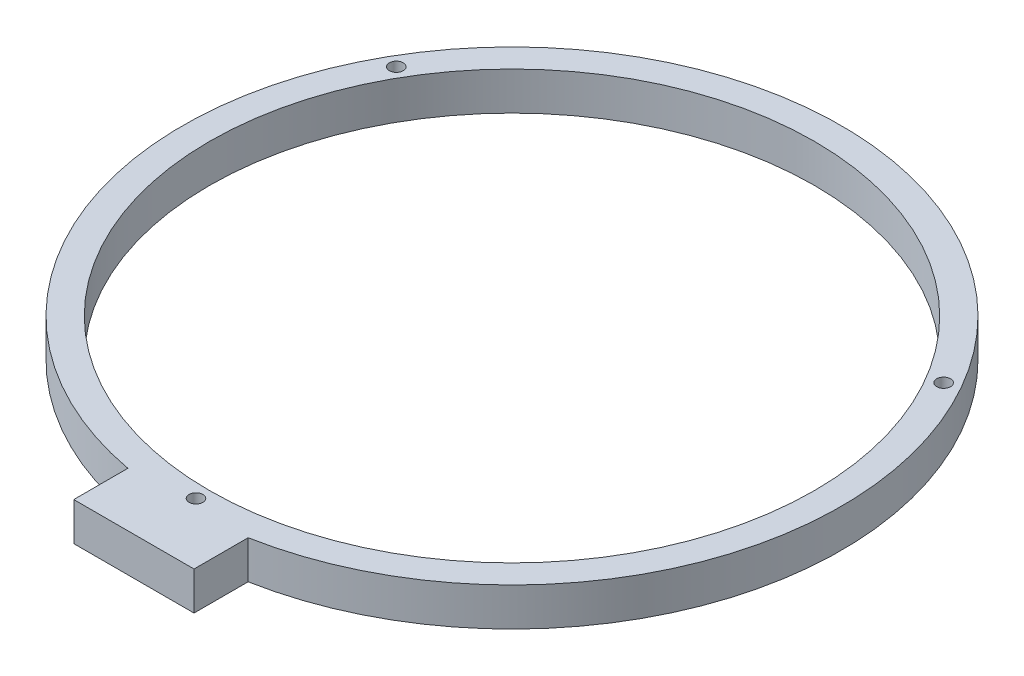
ISO-10303-21;
HEADER;
FILE_DESCRIPTION(('STEP AP214'),'2;1');
FILE_NAME('part.step','',(''),(''),'','','');
FILE_SCHEMA(('AUTOMOTIVE_DESIGN { 1 0 10303 214 1 1 1 1 }'));
ENDSEC;
DATA;
#1=APPLICATION_CONTEXT('core data for automotive mechanical design processes');
#2=APPLICATION_PROTOCOL_DEFINITION('international standard','automotive_design',2000,#1);
#3=PRODUCT_CONTEXT('',#1,'mechanical');
#4=PRODUCT('Part','Part','',(#3));
#5=PRODUCT_RELATED_PRODUCT_CATEGORY('part','',(#4));
#6=PRODUCT_DEFINITION_FORMATION('','',#4);
#7=PRODUCT_DEFINITION_CONTEXT('part definition',#1,'design');
#8=PRODUCT_DEFINITION('design','',#6,#7);
#9=PRODUCT_DEFINITION_SHAPE('','',#8);
#10=(LENGTH_UNIT() NAMED_UNIT(*) SI_UNIT(.MILLI.,.METRE.));
#11=(NAMED_UNIT(*) PLANE_ANGLE_UNIT() SI_UNIT($,.RADIAN.));
#12=(NAMED_UNIT(*) SI_UNIT($,.STERADIAN.) SOLID_ANGLE_UNIT());
#13=UNCERTAINTY_MEASURE_WITH_UNIT(LENGTH_MEASURE(1.E-05),#10,'distance_accuracy_value','');
#14=(GEOMETRIC_REPRESENTATION_CONTEXT(3) GLOBAL_UNCERTAINTY_ASSIGNED_CONTEXT((#13)) GLOBAL_UNIT_ASSIGNED_CONTEXT((#10,
#11,#12)) REPRESENTATION_CONTEXT('',''));
#15=CARTESIAN_POINT('',(0.,0.,0.));
#16=DIRECTION('',(0.,0.,1.));
#17=DIRECTION('',(1.,0.,0.));
#18=AXIS2_PLACEMENT_3D('',#15,#16,#17);
#19=CARTESIAN_POINT('',(0.,6.35,0.));
#20=DIRECTION('',(0.,1.,0.));
#21=DIRECTION('',(0.,0.,1.));
#22=AXIS2_PLACEMENT_3D('',#19,#20,#21);
#23=PLANE('',#22);
#24=CARTESIAN_POINT('',(45.5096349688721,6.35,-26.2750000000002));
#25=DIRECTION('',(0.,1.,0.));
#26=DIRECTION('',(0.866025403784436,0.,-0.500000000000004));
#27=AXIS2_PLACEMENT_3D('',#24,#25,#26);
#28=CIRCLE('',#27,1.15);
#29=CARTESIAN_POINT('',(46.5055641832242,6.35,-26.8500000000002));
#30=VERTEX_POINT('',#29);
#31=EDGE_CURVE('E130',#30,#30,#28,.T.);
#32=ORIENTED_EDGE('',*,*,#31,.F.);
#33=EDGE_LOOP('',(#32));
#34=FACE_BOUND('',#33,.T.);
#35=CARTESIAN_POINT('',(-45.5096349688725,6.35,-26.2749999999996));
#36=DIRECTION('',(0.,1.,0.));
#37=DIRECTION('',(-0.866025403784443,0.,-0.499999999999992));
#38=AXIS2_PLACEMENT_3D('',#35,#36,#37);
#39=CIRCLE('',#38,1.15);
#40=CARTESIAN_POINT('',(-46.5055641832246,6.35,-26.8499999999996));
#41=VERTEX_POINT('',#40);
#42=EDGE_CURVE('E131',#41,#41,#39,.T.);
#43=ORIENTED_EDGE('',*,*,#42,.F.);
#44=EDGE_LOOP('',(#43));
#45=FACE_BOUND('',#44,.T.);
#46=CARTESIAN_POINT('',(0.,6.35,52.55));
#47=DIRECTION('',(0.,1.,0.));
#48=DIRECTION('',(0.,0.,1.));
#49=AXIS2_PLACEMENT_3D('',#46,#47,#48);
#50=CIRCLE('',#49,1.15);
#51=CARTESIAN_POINT('',(0.,6.35,53.7));
#52=VERTEX_POINT('',#51);
#53=EDGE_CURVE('E123',#52,#52,#50,.T.);
#54=ORIENTED_EDGE('',*,*,#53,.F.);
#55=EDGE_LOOP('',(#54));
#56=FACE_BOUND('',#55,.T.);
#57=CARTESIAN_POINT('',(0.,6.35,0.));
#58=DIRECTION('',(0.,1.,0.));
#59=DIRECTION('',(0.,0.,1.));
#60=AXIS2_PLACEMENT_3D('',#57,#58,#59);
#61=CIRCLE('',#60,54.8);
#62=CARTESIAN_POINT('',(10.,6.35,53.8798663695448));
#63=VERTEX_POINT('',#62);
#64=CARTESIAN_POINT('',(-10.,6.35,53.8798663695448));
#65=VERTEX_POINT('',#64);
#66=EDGE_CURVE('E88',#63,#65,#61,.T.);
#67=ORIENTED_EDGE('',*,*,#66,.T.);
#68=DIRECTION('',(0.,0.,1.));
#69=VECTOR('',#68,1.);
#70=CARTESIAN_POINT('',(-10.,6.35,53.8798663695448));
#71=LINE('',#70,#69);
#72=CARTESIAN_POINT('',(-10.,6.35,62.8798663695448));
#73=VERTEX_POINT('',#72);
#74=EDGE_CURVE('E83',#65,#73,#71,.T.);
#75=ORIENTED_EDGE('',*,*,#74,.T.);
#76=DIRECTION('',(1.,0.,0.));
#77=VECTOR('',#76,1.);
#78=CARTESIAN_POINT('',(-10.,6.35,62.8798663695448));
#79=LINE('',#78,#77);
#80=CARTESIAN_POINT('',(10.,6.35,62.8798663695448));
#81=VERTEX_POINT('',#80);
#82=EDGE_CURVE('E86',#73,#81,#79,.T.);
#83=ORIENTED_EDGE('',*,*,#82,.T.);
#84=DIRECTION('',(0.,0.,-1.));
#85=VECTOR('',#84,1.);
#86=CARTESIAN_POINT('',(10.,6.35,62.8798663695448));
#87=LINE('',#86,#85);
#88=EDGE_CURVE('E53',#81,#63,#87,.T.);
#89=ORIENTED_EDGE('',*,*,#88,.T.);
#90=EDGE_LOOP('',(#67,#75,#83,#89));
#91=FACE_BOUND('',#90,.T.);
#92=CARTESIAN_POINT('',(0.,6.35,0.));
#93=DIRECTION('',(0.,1.,0.));
#94=DIRECTION('',(0.,0.,1.));
#95=AXIS2_PLACEMENT_3D('',#92,#93,#94);
#96=CIRCLE('',#95,50.3);
#97=CARTESIAN_POINT('',(0.,6.35,50.3));
#98=VERTEX_POINT('',#97);
#99=EDGE_CURVE('E103',#98,#98,#96,.T.);
#100=ORIENTED_EDGE('',*,*,#99,.F.);
#101=EDGE_LOOP('',(#100));
#102=FACE_BOUND('',#101,.T.);
#103=ADVANCED_FACE('F36',(#34,#45,#56,#91,#102),#23,.T.);
#104=CARTESIAN_POINT('',(0.,0.,0.));
#105=DIRECTION('',(0.,1.,0.));
#106=DIRECTION('',(0.,0.,1.));
#107=AXIS2_PLACEMENT_3D('',#104,#105,#106);
#108=PLANE('',#107);
#109=CARTESIAN_POINT('',(45.5096349688721,0.,-26.2750000000002));
#110=DIRECTION('',(0.,1.,0.));
#111=DIRECTION('',(0.,0.,1.));
#112=AXIS2_PLACEMENT_3D('',#109,#110,#111);
#113=CIRCLE('',#112,1.15);
#114=CARTESIAN_POINT('',(45.5096349688721,0.,-25.1250000000002));
#115=VERTEX_POINT('',#114);
#116=EDGE_CURVE('E126',#115,#115,#113,.F.);
#117=ORIENTED_EDGE('',*,*,#116,.F.);
#118=EDGE_LOOP('',(#117));
#119=FACE_BOUND('',#118,.T.);
#120=CARTESIAN_POINT('',(-45.5096349688725,0.,-26.2749999999996));
#121=DIRECTION('',(0.,1.,0.));
#122=DIRECTION('',(0.,0.,1.));
#123=AXIS2_PLACEMENT_3D('',#120,#121,#122);
#124=CIRCLE('',#123,1.15);
#125=CARTESIAN_POINT('',(-45.5096349688725,0.,-25.1249999999996));
#126=VERTEX_POINT('',#125);
#127=EDGE_CURVE('E127',#126,#126,#124,.F.);
#128=ORIENTED_EDGE('',*,*,#127,.F.);
#129=EDGE_LOOP('',(#128));
#130=FACE_BOUND('',#129,.T.);
#131=CARTESIAN_POINT('',(0.,0.,52.55));
#132=DIRECTION('',(0.,1.,0.));
#133=DIRECTION('',(0.,0.,1.));
#134=AXIS2_PLACEMENT_3D('',#131,#132,#133);
#135=CIRCLE('',#134,1.15);
#136=CARTESIAN_POINT('',(0.,0.,53.7));
#137=VERTEX_POINT('',#136);
#138=EDGE_CURVE('E118',#137,#137,#135,.F.);
#139=ORIENTED_EDGE('',*,*,#138,.F.);
#140=EDGE_LOOP('',(#139));
#141=FACE_BOUND('',#140,.T.);
#142=CARTESIAN_POINT('',(0.,0.,0.));
#143=DIRECTION('',(0.,1.,0.));
#144=DIRECTION('',(0.,0.,1.));
#145=AXIS2_PLACEMENT_3D('',#142,#143,#144);
#146=CIRCLE('',#145,54.8);
#147=CARTESIAN_POINT('',(10.,0.,53.8798663695448));
#148=VERTEX_POINT('',#147);
#149=CARTESIAN_POINT('',(-10.,0.,53.8798663695448));
#150=VERTEX_POINT('',#149);
#151=EDGE_CURVE('E100',#148,#150,#146,.T.);
#152=ORIENTED_EDGE('',*,*,#151,.F.);
#153=DIRECTION('',(0.,0.,-1.));
#154=VECTOR('',#153,1.);
#155=CARTESIAN_POINT('',(10.,0.,62.8798663695448));
#156=LINE('',#155,#154);
#157=CARTESIAN_POINT('',(10.,0.,62.8798663695448));
#158=VERTEX_POINT('',#157);
#159=EDGE_CURVE('E76',#158,#148,#156,.T.);
#160=ORIENTED_EDGE('',*,*,#159,.F.);
#161=DIRECTION('',(1.,0.,0.));
#162=VECTOR('',#161,1.);
#163=CARTESIAN_POINT('',(-10.,0.,62.8798663695448));
#164=LINE('',#163,#162);
#165=CARTESIAN_POINT('',(-10.,0.,62.8798663695448));
#166=VERTEX_POINT('',#165);
#167=EDGE_CURVE('E70',#166,#158,#164,.T.);
#168=ORIENTED_EDGE('',*,*,#167,.F.);
#169=DIRECTION('',(0.,0.,1.));
#170=VECTOR('',#169,1.);
#171=CARTESIAN_POINT('',(-10.,0.,53.8798663695448));
#172=LINE('',#171,#170);
#173=EDGE_CURVE('E92',#150,#166,#172,.T.);
#174=ORIENTED_EDGE('',*,*,#173,.F.);
#175=EDGE_LOOP('',(#152,#160,#168,#174));
#176=FACE_BOUND('',#175,.T.);
#177=CARTESIAN_POINT('',(0.,0.,0.));
#178=DIRECTION('',(0.,1.,0.));
#179=DIRECTION('',(0.,0.,1.));
#180=AXIS2_PLACEMENT_3D('',#177,#178,#179);
#181=CIRCLE('',#180,50.3);
#182=CARTESIAN_POINT('',(0.,0.,50.3));
#183=VERTEX_POINT('',#182);
#184=EDGE_CURVE('E115',#183,#183,#181,.T.);
#185=ORIENTED_EDGE('',*,*,#184,.T.);
#186=EDGE_LOOP('',(#185));
#187=FACE_BOUND('',#186,.T.);
#188=ADVANCED_FACE('F111',(#119,#130,#141,#176,#187),#108,.F.);
#189=CARTESIAN_POINT('',(0.,6.35,0.));
#190=DIRECTION('',(0.,-1.,0.));
#191=DIRECTION('',(0.,0.,-1.));
#192=AXIS2_PLACEMENT_3D('',#189,#190,#191);
#193=CYLINDRICAL_SURFACE('',#192,54.8);
#194=ORIENTED_EDGE('',*,*,#151,.T.);
#195=DIRECTION('',(0.,-1.,0.));
#196=VECTOR('',#195,1.);
#197=CARTESIAN_POINT('',(-10.,6.35,53.8798663695448));
#198=LINE('',#197,#196);
#199=EDGE_CURVE('E11',#65,#150,#198,.T.);
#200=ORIENTED_EDGE('',*,*,#199,.F.);
#201=ORIENTED_EDGE('',*,*,#66,.F.);
#202=DIRECTION('',(0.,-1.,0.));
#203=VECTOR('',#202,1.);
#204=CARTESIAN_POINT('',(10.,6.35,53.8798663695448));
#205=LINE('',#204,#203);
#206=EDGE_CURVE('E96',#63,#148,#205,.T.);
#207=ORIENTED_EDGE('',*,*,#206,.T.);
#208=EDGE_LOOP('',(#194,#200,#201,#207));
#209=FACE_BOUND('',#208,.T.);
#210=ADVANCED_FACE('F38',(#209),#193,.T.);
#211=CARTESIAN_POINT('',(-10.,6.35,53.8798663695448));
#212=DIRECTION('',(1.,0.,0.));
#213=DIRECTION('',(0.,0.,-1.));
#214=AXIS2_PLACEMENT_3D('',#211,#212,#213);
#215=PLANE('',#214);
#216=ORIENTED_EDGE('',*,*,#173,.T.);
#217=DIRECTION('',(0.,-1.,0.));
#218=VECTOR('',#217,1.);
#219=CARTESIAN_POINT('',(-10.,6.35,62.8798663695448));
#220=LINE('',#219,#218);
#221=EDGE_CURVE('E45',#73,#166,#220,.T.);
#222=ORIENTED_EDGE('',*,*,#221,.F.);
#223=ORIENTED_EDGE('',*,*,#74,.F.);
#224=ORIENTED_EDGE('',*,*,#199,.T.);
#225=EDGE_LOOP('',(#216,#222,#223,#224));
#226=FACE_BOUND('',#225,.T.);
#227=ADVANCED_FACE('F91',(#226),#215,.F.);
#228=CARTESIAN_POINT('',(-10.,6.35,62.8798663695448));
#229=DIRECTION('',(0.,0.,-1.));
#230=DIRECTION('',(-1.,0.,0.));
#231=AXIS2_PLACEMENT_3D('',#228,#229,#230);
#232=PLANE('',#231);
#233=ORIENTED_EDGE('',*,*,#167,.T.);
#234=DIRECTION('',(0.,-1.,0.));
#235=VECTOR('',#234,1.);
#236=CARTESIAN_POINT('',(10.,6.35,62.8798663695448));
#237=LINE('',#236,#235);
#238=EDGE_CURVE('E93',#81,#158,#237,.T.);
#239=ORIENTED_EDGE('',*,*,#238,.F.);
#240=ORIENTED_EDGE('',*,*,#82,.F.);
#241=ORIENTED_EDGE('',*,*,#221,.T.);
#242=EDGE_LOOP('',(#233,#239,#240,#241));
#243=FACE_BOUND('',#242,.T.);
#244=ADVANCED_FACE('F94',(#243),#232,.F.);
#245=CARTESIAN_POINT('',(10.,6.35,62.8798663695448));
#246=DIRECTION('',(-1.,0.,0.));
#247=DIRECTION('',(0.,0.,1.));
#248=AXIS2_PLACEMENT_3D('',#245,#246,#247);
#249=PLANE('',#248);
#250=ORIENTED_EDGE('',*,*,#159,.T.);
#251=ORIENTED_EDGE('',*,*,#206,.F.);
#252=ORIENTED_EDGE('',*,*,#88,.F.);
#253=ORIENTED_EDGE('',*,*,#238,.T.);
#254=EDGE_LOOP('',(#250,#251,#252,#253));
#255=FACE_BOUND('',#254,.T.);
#256=ADVANCED_FACE('F108',(#255),#249,.F.);
#257=CARTESIAN_POINT('',(0.,6.35,0.));
#258=DIRECTION('',(0.,-1.,0.));
#259=DIRECTION('',(0.,0.,-1.));
#260=AXIS2_PLACEMENT_3D('',#257,#258,#259);
#261=CYLINDRICAL_SURFACE('',#260,50.3);
#262=ORIENTED_EDGE('',*,*,#99,.T.);
#263=EDGE_LOOP('',(#262));
#264=FACE_BOUND('',#263,.T.);
#265=ORIENTED_EDGE('',*,*,#184,.F.);
#266=EDGE_LOOP('',(#265));
#267=FACE_BOUND('',#266,.T.);
#268=ADVANCED_FACE('F153',(#264,#267),#261,.F.);
#269=CARTESIAN_POINT('',(0.,-0.00100000000000013,52.55));
#270=DIRECTION('',(0.,1.,0.));
#271=DIRECTION('',(0.,0.,1.));
#272=AXIS2_PLACEMENT_3D('',#269,#270,#271);
#273=CYLINDRICAL_SURFACE('',#272,1.15);
#274=ORIENTED_EDGE('',*,*,#53,.T.);
#275=EDGE_LOOP('',(#274));
#276=FACE_BOUND('',#275,.T.);
#277=ORIENTED_EDGE('',*,*,#138,.T.);
#278=EDGE_LOOP('',(#277));
#279=FACE_BOUND('',#278,.T.);
#280=ADVANCED_FACE('F149',(#276,#279),#273,.F.);
#281=CARTESIAN_POINT('',(-45.5096349688725,-0.00100000000000013,-26.2749999999996));
#282=DIRECTION('',(0.,1.,0.));
#283=DIRECTION('',(0.,0.,1.));
#284=AXIS2_PLACEMENT_3D('',#281,#282,#283);
#285=CYLINDRICAL_SURFACE('',#284,1.15);
#286=ORIENTED_EDGE('',*,*,#42,.T.);
#287=EDGE_LOOP('',(#286));
#288=FACE_BOUND('',#287,.T.);
#289=ORIENTED_EDGE('',*,*,#127,.T.);
#290=EDGE_LOOP('',(#289));
#291=FACE_BOUND('',#290,.T.);
#292=ADVANCED_FACE('F152',(#288,#291),#285,.F.);
#293=CARTESIAN_POINT('',(45.5096349688721,-0.00100000000000013,-26.2750000000002));
#294=DIRECTION('',(0.,1.,0.));
#295=DIRECTION('',(0.,0.,1.));
#296=AXIS2_PLACEMENT_3D('',#293,#294,#295);
#297=CYLINDRICAL_SURFACE('',#296,1.15);
#298=ORIENTED_EDGE('',*,*,#31,.T.);
#299=EDGE_LOOP('',(#298));
#300=FACE_BOUND('',#299,.T.);
#301=ORIENTED_EDGE('',*,*,#116,.T.);
#302=EDGE_LOOP('',(#301));
#303=FACE_BOUND('',#302,.T.);
#304=ADVANCED_FACE('F139',(#300,#303),#297,.F.);
#305=CLOSED_SHELL('',(#103,#188,#210,#227,#244,#256,#268,#280,#292,#304));
#306=MANIFOLD_SOLID_BREP('B2',#305);
#307=ADVANCED_BREP_SHAPE_REPRESENTATION('',(#18,#306),#14);
#308=SHAPE_DEFINITION_REPRESENTATION(#9,#307);
ENDSEC;
END-ISO-10303-21;
